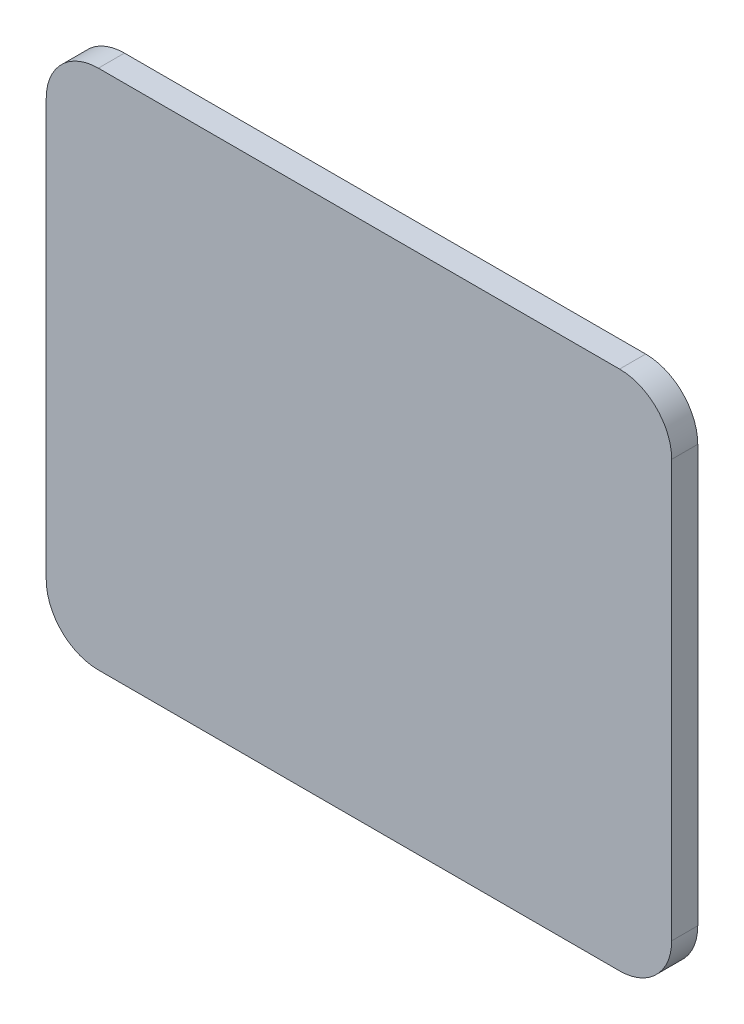
ISO-10303-21;
HEADER;
FILE_DESCRIPTION(('STEP AP214'),'2;1');
FILE_NAME('part.step','',(''),(''),'','','');
FILE_SCHEMA(('AUTOMOTIVE_DESIGN { 1 0 10303 214 1 1 1 1 }'));
ENDSEC;
DATA;
#1=APPLICATION_CONTEXT('core data for automotive mechanical design processes');
#2=APPLICATION_PROTOCOL_DEFINITION('international standard','automotive_design',2000,#1);
#3=PRODUCT_CONTEXT('',#1,'mechanical');
#4=PRODUCT('Part','Part','',(#3));
#5=PRODUCT_RELATED_PRODUCT_CATEGORY('part','',(#4));
#6=PRODUCT_DEFINITION_FORMATION('','',#4);
#7=PRODUCT_DEFINITION_CONTEXT('part definition',#1,'design');
#8=PRODUCT_DEFINITION('design','',#6,#7);
#9=PRODUCT_DEFINITION_SHAPE('','',#8);
#10=(LENGTH_UNIT() NAMED_UNIT(*) SI_UNIT(.MILLI.,.METRE.));
#11=(NAMED_UNIT(*) PLANE_ANGLE_UNIT() SI_UNIT($,.RADIAN.));
#12=(NAMED_UNIT(*) SI_UNIT($,.STERADIAN.) SOLID_ANGLE_UNIT());
#13=UNCERTAINTY_MEASURE_WITH_UNIT(LENGTH_MEASURE(1.E-05),#10,'distance_accuracy_value','');
#14=(GEOMETRIC_REPRESENTATION_CONTEXT(3) GLOBAL_UNCERTAINTY_ASSIGNED_CONTEXT((#13)) GLOBAL_UNIT_ASSIGNED_CONTEXT((#10,
#11,#12)) REPRESENTATION_CONTEXT('',''));
#15=CARTESIAN_POINT('',(0.,0.,0.));
#16=DIRECTION('',(0.,0.,1.));
#17=DIRECTION('',(1.,0.,0.));
#18=AXIS2_PLACEMENT_3D('',#15,#16,#17);
#19=CARTESIAN_POINT('',(-60.,-50.,5.));
#20=DIRECTION('',(-1.,0.,0.));
#21=DIRECTION('',(0.,0.,1.));
#22=AXIS2_PLACEMENT_3D('',#19,#20,#21);
#23=PLANE('',#22);
#24=DIRECTION('',(0.,1.,0.));
#25=VECTOR('',#24,1.);
#26=CARTESIAN_POINT('',(-60.,-50.,5.));
#27=LINE('',#26,#25);
#28=CARTESIAN_POINT('',(-60.,-40.,5.));
#29=VERTEX_POINT('',#28);
#30=CARTESIAN_POINT('',(-60.,40.,5.));
#31=VERTEX_POINT('',#30);
#32=EDGE_CURVE('E190',#29,#31,#27,.T.);
#33=ORIENTED_EDGE('',*,*,#32,.T.);
#34=DIRECTION('',(0.,0.,-1.));
#35=VECTOR('',#34,1.);
#36=CARTESIAN_POINT('',(-60.,40.,5.));
#37=LINE('',#36,#35);
#38=CARTESIAN_POINT('',(-60.,40.,0.));
#39=VERTEX_POINT('',#38);
#40=EDGE_CURVE('E126',#31,#39,#37,.T.);
#41=ORIENTED_EDGE('',*,*,#40,.T.);
#42=DIRECTION('',(0.,1.,0.));
#43=VECTOR('',#42,1.);
#44=CARTESIAN_POINT('',(-60.,-50.,0.));
#45=LINE('',#44,#43);
#46=CARTESIAN_POINT('',(-60.,-40.,0.));
#47=VERTEX_POINT('',#46);
#48=EDGE_CURVE('E109',#47,#39,#45,.T.);
#49=ORIENTED_EDGE('',*,*,#48,.F.);
#50=DIRECTION('',(0.,0.,-1.));
#51=VECTOR('',#50,1.);
#52=CARTESIAN_POINT('',(-60.,-40.,5.));
#53=LINE('',#52,#51);
#54=EDGE_CURVE('E123',#47,#29,#53,.F.);
#55=ORIENTED_EDGE('',*,*,#54,.T.);
#56=EDGE_LOOP('',(#33,#41,#49,#55));
#57=FACE_BOUND('',#56,.T.);
#58=ADVANCED_FACE('F39',(#57),#23,.T.);
#59=CARTESIAN_POINT('',(-60.,-50.,5.));
#60=DIRECTION('',(0.,1.,0.));
#61=DIRECTION('',(0.,0.,1.));
#62=AXIS2_PLACEMENT_3D('',#59,#60,#61);
#63=PLANE('',#62);
#64=DIRECTION('',(1.,0.,0.));
#65=VECTOR('',#64,1.);
#66=CARTESIAN_POINT('',(-60.,-50.,5.));
#67=LINE('',#66,#65);
#68=CARTESIAN_POINT('',(-50.,-50.,5.));
#69=VERTEX_POINT('',#68);
#70=CARTESIAN_POINT('',(50.,-50.,5.));
#71=VERTEX_POINT('',#70);
#72=EDGE_CURVE('E134',#69,#71,#67,.T.);
#73=ORIENTED_EDGE('',*,*,#72,.F.);
#74=DIRECTION('',(0.,0.,-1.));
#75=VECTOR('',#74,1.);
#76=CARTESIAN_POINT('',(-50.,-50.,0.));
#77=LINE('',#76,#75);
#78=CARTESIAN_POINT('',(-50.,-50.,0.));
#79=VERTEX_POINT('',#78);
#80=EDGE_CURVE('E171',#69,#79,#77,.T.);
#81=ORIENTED_EDGE('',*,*,#80,.T.);
#82=DIRECTION('',(1.,0.,0.));
#83=VECTOR('',#82,1.);
#84=CARTESIAN_POINT('',(-60.,-50.,0.));
#85=LINE('',#84,#83);
#86=CARTESIAN_POINT('',(50.,-50.,0.));
#87=VERTEX_POINT('',#86);
#88=EDGE_CURVE('E111',#79,#87,#85,.T.);
#89=ORIENTED_EDGE('',*,*,#88,.T.);
#90=DIRECTION('',(0.,0.,-1.));
#91=VECTOR('',#90,1.);
#92=CARTESIAN_POINT('',(50.,-50.,5.));
#93=LINE('',#92,#91);
#94=EDGE_CURVE('E168',#87,#71,#93,.F.);
#95=ORIENTED_EDGE('',*,*,#94,.T.);
#96=EDGE_LOOP('',(#73,#81,#89,#95));
#97=FACE_BOUND('',#96,.T.);
#98=ADVANCED_FACE('F176',(#97),#63,.F.);
#99=CARTESIAN_POINT('',(60.,-50.,5.));
#100=DIRECTION('',(-1.,0.,0.));
#101=DIRECTION('',(0.,0.,1.));
#102=AXIS2_PLACEMENT_3D('',#99,#100,#101);
#103=PLANE('',#102);
#104=DIRECTION('',(0.,1.,0.));
#105=VECTOR('',#104,1.);
#106=CARTESIAN_POINT('',(60.,-50.,5.));
#107=LINE('',#106,#105);
#108=CARTESIAN_POINT('',(60.,-40.,5.));
#109=VERTEX_POINT('',#108);
#110=CARTESIAN_POINT('',(60.,40.,5.));
#111=VERTEX_POINT('',#110);
#112=EDGE_CURVE('E140',#109,#111,#107,.T.);
#113=ORIENTED_EDGE('',*,*,#112,.F.);
#114=DIRECTION('',(0.,0.,-1.));
#115=VECTOR('',#114,1.);
#116=CARTESIAN_POINT('',(60.,-40.,5.));
#117=LINE('',#116,#115);
#118=CARTESIAN_POINT('',(60.,-40.,0.));
#119=VERTEX_POINT('',#118);
#120=EDGE_CURVE('E11',#109,#119,#117,.T.);
#121=ORIENTED_EDGE('',*,*,#120,.T.);
#122=DIRECTION('',(0.,1.,0.));
#123=VECTOR('',#122,1.);
#124=CARTESIAN_POINT('',(60.,-50.,0.));
#125=LINE('',#124,#123);
#126=CARTESIAN_POINT('',(60.,40.,0.));
#127=VERTEX_POINT('',#126);
#128=EDGE_CURVE('E185',#119,#127,#125,.T.);
#129=ORIENTED_EDGE('',*,*,#128,.T.);
#130=DIRECTION('',(0.,0.,-1.));
#131=VECTOR('',#130,1.);
#132=CARTESIAN_POINT('',(60.,40.,5.));
#133=LINE('',#132,#131);
#134=EDGE_CURVE('E48',#127,#111,#133,.F.);
#135=ORIENTED_EDGE('',*,*,#134,.T.);
#136=EDGE_LOOP('',(#113,#121,#129,#135));
#137=FACE_BOUND('',#136,.T.);
#138=ADVANCED_FACE('F184',(#137),#103,.F.);
#139=CARTESIAN_POINT('',(-60.,50.,5.));
#140=DIRECTION('',(0.,1.,0.));
#141=DIRECTION('',(0.,0.,1.));
#142=AXIS2_PLACEMENT_3D('',#139,#140,#141);
#143=PLANE('',#142);
#144=DIRECTION('',(1.,0.,0.));
#145=VECTOR('',#144,1.);
#146=CARTESIAN_POINT('',(-60.,50.,0.));
#147=LINE('',#146,#145);
#148=CARTESIAN_POINT('',(-50.,50.,0.));
#149=VERTEX_POINT('',#148);
#150=CARTESIAN_POINT('',(50.,50.,0.));
#151=VERTEX_POINT('',#150);
#152=EDGE_CURVE('E128',#149,#151,#147,.T.);
#153=ORIENTED_EDGE('',*,*,#152,.F.);
#154=DIRECTION('',(0.,0.,-1.));
#155=VECTOR('',#154,1.);
#156=CARTESIAN_POINT('',(-50.,50.,5.));
#157=LINE('',#156,#155);
#158=CARTESIAN_POINT('',(-50.,50.,5.));
#159=VERTEX_POINT('',#158);
#160=EDGE_CURVE('E155',#149,#159,#157,.F.);
#161=ORIENTED_EDGE('',*,*,#160,.T.);
#162=DIRECTION('',(1.,0.,0.));
#163=VECTOR('',#162,1.);
#164=CARTESIAN_POINT('',(-60.,50.,5.));
#165=LINE('',#164,#163);
#166=CARTESIAN_POINT('',(50.,50.,5.));
#167=VERTEX_POINT('',#166);
#168=EDGE_CURVE('E195',#159,#167,#165,.T.);
#169=ORIENTED_EDGE('',*,*,#168,.T.);
#170=DIRECTION('',(0.,0.,-1.));
#171=VECTOR('',#170,1.);
#172=CARTESIAN_POINT('',(50.,50.,0.));
#173=LINE('',#172,#171);
#174=EDGE_CURVE('E151',#167,#151,#173,.T.);
#175=ORIENTED_EDGE('',*,*,#174,.T.);
#176=EDGE_LOOP('',(#153,#161,#169,#175));
#177=FACE_BOUND('',#176,.T.);
#178=ADVANCED_FACE('F206',(#177),#143,.T.);
#179=CARTESIAN_POINT('',(0.,0.,5.));
#180=DIRECTION('',(0.,0.,-1.));
#181=DIRECTION('',(-1.,0.,0.));
#182=AXIS2_PLACEMENT_3D('',#179,#180,#181);
#183=PLANE('',#182);
#184=ORIENTED_EDGE('',*,*,#168,.F.);
#185=CARTESIAN_POINT('',(-50.,40.,5.));
#186=DIRECTION('',(0.,0.,-1.));
#187=DIRECTION('',(-1.,0.,0.));
#188=AXIS2_PLACEMENT_3D('',#185,#186,#187);
#189=CIRCLE('',#188,10.);
#190=EDGE_CURVE('E165',#159,#31,#189,.F.);
#191=ORIENTED_EDGE('',*,*,#190,.T.);
#192=ORIENTED_EDGE('',*,*,#32,.F.);
#193=CARTESIAN_POINT('',(-50.,-40.,5.));
#194=DIRECTION('',(0.,0.,-1.));
#195=DIRECTION('',(-1.,0.,0.));
#196=AXIS2_PLACEMENT_3D('',#193,#194,#195);
#197=CIRCLE('',#196,10.);
#198=EDGE_CURVE('E132',#29,#69,#197,.F.);
#199=ORIENTED_EDGE('',*,*,#198,.T.);
#200=ORIENTED_EDGE('',*,*,#72,.T.);
#201=CARTESIAN_POINT('',(50.,-40.,5.));
#202=DIRECTION('',(0.,0.,-1.));
#203=DIRECTION('',(-1.,0.,0.));
#204=AXIS2_PLACEMENT_3D('',#201,#202,#203);
#205=CIRCLE('',#204,10.);
#206=EDGE_CURVE('E61',#71,#109,#205,.F.);
#207=ORIENTED_EDGE('',*,*,#206,.T.);
#208=ORIENTED_EDGE('',*,*,#112,.T.);
#209=CARTESIAN_POINT('',(50.,40.,5.));
#210=DIRECTION('',(0.,0.,-1.));
#211=DIRECTION('',(-1.,0.,0.));
#212=AXIS2_PLACEMENT_3D('',#209,#210,#211);
#213=CIRCLE('',#212,10.);
#214=EDGE_CURVE('E158',#111,#167,#213,.F.);
#215=ORIENTED_EDGE('',*,*,#214,.T.);
#216=EDGE_LOOP('',(#184,#191,#192,#199,#200,#207,#208,#215));
#217=FACE_BOUND('',#216,.T.);
#218=ADVANCED_FACE('F179',(#217),#183,.F.);
#219=CARTESIAN_POINT('',(0.,0.,0.));
#220=DIRECTION('',(0.,0.,-1.));
#221=DIRECTION('',(-1.,0.,0.));
#222=AXIS2_PLACEMENT_3D('',#219,#220,#221);
#223=PLANE('',#222);
#224=ORIENTED_EDGE('',*,*,#48,.T.);
#225=CARTESIAN_POINT('',(-50.,40.,0.));
#226=DIRECTION('',(0.,0.,-1.));
#227=DIRECTION('',(-1.,0.,0.));
#228=AXIS2_PLACEMENT_3D('',#225,#226,#227);
#229=CIRCLE('',#228,10.);
#230=EDGE_CURVE('E117',#39,#149,#229,.T.);
#231=ORIENTED_EDGE('',*,*,#230,.T.);
#232=ORIENTED_EDGE('',*,*,#152,.T.);
#233=CARTESIAN_POINT('',(50.,40.,0.));
#234=DIRECTION('',(0.,0.,-1.));
#235=DIRECTION('',(-1.,0.,0.));
#236=AXIS2_PLACEMENT_3D('',#233,#234,#235);
#237=CIRCLE('',#236,10.);
#238=EDGE_CURVE('E138',#151,#127,#237,.T.);
#239=ORIENTED_EDGE('',*,*,#238,.T.);
#240=ORIENTED_EDGE('',*,*,#128,.F.);
#241=CARTESIAN_POINT('',(50.,-40.,0.));
#242=DIRECTION('',(0.,0.,-1.));
#243=DIRECTION('',(-1.,0.,0.));
#244=AXIS2_PLACEMENT_3D('',#241,#242,#243);
#245=CIRCLE('',#244,10.);
#246=EDGE_CURVE('E118',#119,#87,#245,.T.);
#247=ORIENTED_EDGE('',*,*,#246,.T.);
#248=ORIENTED_EDGE('',*,*,#88,.F.);
#249=CARTESIAN_POINT('',(-50.,-40.,0.));
#250=DIRECTION('',(0.,0.,-1.));
#251=DIRECTION('',(-1.,0.,0.));
#252=AXIS2_PLACEMENT_3D('',#249,#250,#251);
#253=CIRCLE('',#252,10.);
#254=EDGE_CURVE('E106',#79,#47,#253,.T.);
#255=ORIENTED_EDGE('',*,*,#254,.T.);
#256=EDGE_LOOP('',(#224,#231,#232,#239,#240,#247,#248,#255));
#257=FACE_BOUND('',#256,.T.);
#258=ADVANCED_FACE('F108',(#257),#223,.T.);
#259=CARTESIAN_POINT('',(-50.,40.,5.));
#260=DIRECTION('',(0.,0.,-1.));
#261=DIRECTION('',(-1.,0.,0.));
#262=AXIS2_PLACEMENT_3D('',#259,#260,#261);
#263=CYLINDRICAL_SURFACE('',#262,10.);
#264=ORIENTED_EDGE('',*,*,#190,.F.);
#265=ORIENTED_EDGE('',*,*,#160,.F.);
#266=ORIENTED_EDGE('',*,*,#230,.F.);
#267=ORIENTED_EDGE('',*,*,#40,.F.);
#268=EDGE_LOOP('',(#264,#265,#266,#267));
#269=FACE_BOUND('',#268,.T.);
#270=ADVANCED_FACE('F202',(#269),#263,.T.);
#271=CARTESIAN_POINT('',(-50.,-40.,5.));
#272=DIRECTION('',(0.,0.,1.));
#273=DIRECTION('',(1.,0.,0.));
#274=AXIS2_PLACEMENT_3D('',#271,#272,#273);
#275=CYLINDRICAL_SURFACE('',#274,10.);
#276=ORIENTED_EDGE('',*,*,#198,.F.);
#277=ORIENTED_EDGE('',*,*,#54,.F.);
#278=ORIENTED_EDGE('',*,*,#254,.F.);
#279=ORIENTED_EDGE('',*,*,#80,.F.);
#280=EDGE_LOOP('',(#276,#277,#278,#279));
#281=FACE_BOUND('',#280,.T.);
#282=ADVANCED_FACE('F131',(#281),#275,.T.);
#283=CARTESIAN_POINT('',(50.,-40.,5.));
#284=DIRECTION('',(0.,0.,-1.));
#285=DIRECTION('',(-1.,0.,0.));
#286=AXIS2_PLACEMENT_3D('',#283,#284,#285);
#287=CYLINDRICAL_SURFACE('',#286,10.);
#288=ORIENTED_EDGE('',*,*,#206,.F.);
#289=ORIENTED_EDGE('',*,*,#94,.F.);
#290=ORIENTED_EDGE('',*,*,#246,.F.);
#291=ORIENTED_EDGE('',*,*,#120,.F.);
#292=EDGE_LOOP('',(#288,#289,#290,#291));
#293=FACE_BOUND('',#292,.T.);
#294=ADVANCED_FACE('F182',(#293),#287,.T.);
#295=CARTESIAN_POINT('',(50.,40.,5.));
#296=DIRECTION('',(0.,0.,1.));
#297=DIRECTION('',(1.,0.,0.));
#298=AXIS2_PLACEMENT_3D('',#295,#296,#297);
#299=CYLINDRICAL_SURFACE('',#298,10.);
#300=ORIENTED_EDGE('',*,*,#214,.F.);
#301=ORIENTED_EDGE('',*,*,#134,.F.);
#302=ORIENTED_EDGE('',*,*,#238,.F.);
#303=ORIENTED_EDGE('',*,*,#174,.F.);
#304=EDGE_LOOP('',(#300,#301,#302,#303));
#305=FACE_BOUND('',#304,.T.);
#306=ADVANCED_FACE('F41',(#305),#299,.T.);
#307=CLOSED_SHELL('',(#58,#98,#138,#178,#218,#258,#270,#282,#294,#306));
#308=MANIFOLD_SOLID_BREP('B2',#307);
#309=ADVANCED_BREP_SHAPE_REPRESENTATION('',(#18,#308),#14);
#310=SHAPE_DEFINITION_REPRESENTATION(#9,#309);
ENDSEC;
END-ISO-10303-21;
